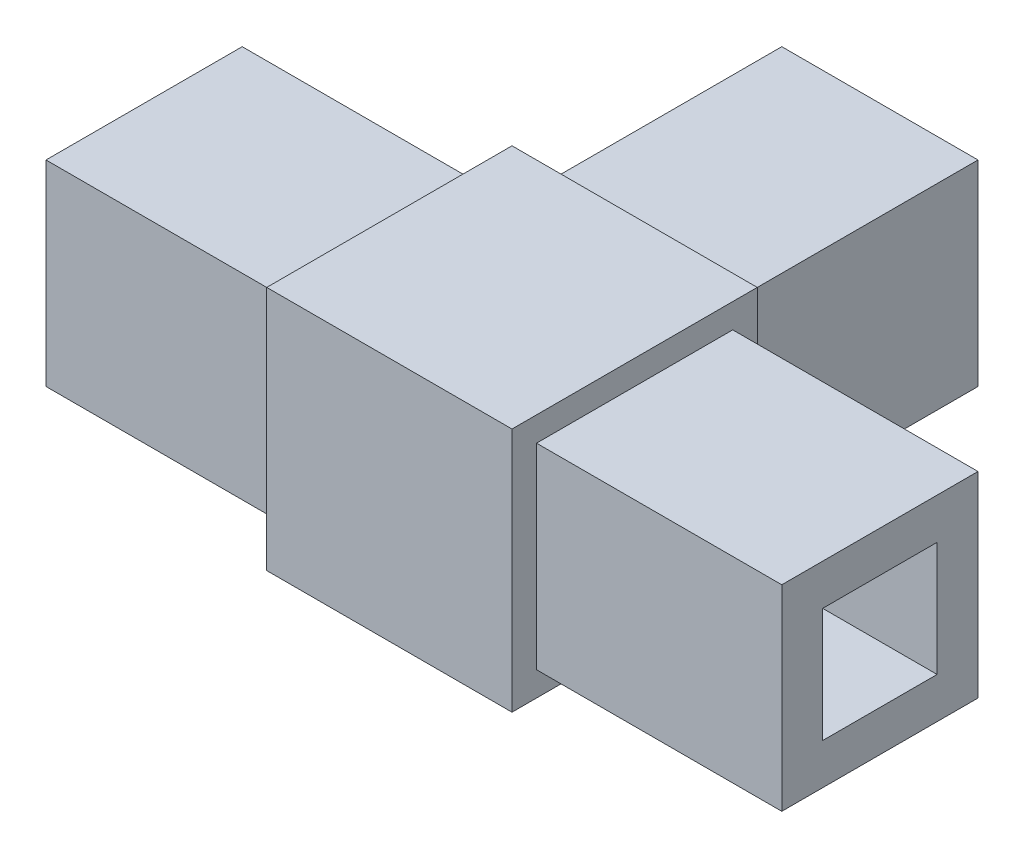
ISO-10303-21;
HEADER;
FILE_DESCRIPTION(('STEP AP214'),'2;1');
FILE_NAME('part.step','',(''),(''),'','','');
FILE_SCHEMA(('AUTOMOTIVE_DESIGN { 1 0 10303 214 1 1 1 1 }'));
ENDSEC;
DATA;
#1=APPLICATION_CONTEXT('core data for automotive mechanical design processes');
#2=APPLICATION_PROTOCOL_DEFINITION('international standard','automotive_design',2000,#1);
#3=PRODUCT_CONTEXT('',#1,'mechanical');
#4=PRODUCT('Part','Part','',(#3));
#5=PRODUCT_RELATED_PRODUCT_CATEGORY('part','',(#4));
#6=PRODUCT_DEFINITION_FORMATION('','',#4);
#7=PRODUCT_DEFINITION_CONTEXT('part definition',#1,'design');
#8=PRODUCT_DEFINITION('design','',#6,#7);
#9=PRODUCT_DEFINITION_SHAPE('','',#8);
#10=(LENGTH_UNIT() NAMED_UNIT(*) SI_UNIT(.MILLI.,.METRE.));
#11=(NAMED_UNIT(*) PLANE_ANGLE_UNIT() SI_UNIT($,.RADIAN.));
#12=(NAMED_UNIT(*) SI_UNIT($,.STERADIAN.) SOLID_ANGLE_UNIT());
#13=UNCERTAINTY_MEASURE_WITH_UNIT(LENGTH_MEASURE(1.E-05),#10,'distance_accuracy_value','');
#14=(GEOMETRIC_REPRESENTATION_CONTEXT(3) GLOBAL_UNCERTAINTY_ASSIGNED_CONTEXT((#13)) GLOBAL_UNIT_ASSIGNED_CONTEXT((#10,
#11,#12)) REPRESENTATION_CONTEXT('',''));
#15=CARTESIAN_POINT('',(0.,0.,0.));
#16=DIRECTION('',(0.,0.,1.));
#17=DIRECTION('',(1.,0.,0.));
#18=AXIS2_PLACEMENT_3D('',#15,#16,#17);
#19=CARTESIAN_POINT('',(45.,30.,-7.72719918892597));
#20=DIRECTION('',(-1.,0.,0.));
#21=DIRECTION('',(0.,0.,1.));
#22=AXIS2_PLACEMENT_3D('',#19,#20,#21);
#23=PLANE('',#22);
#24=DIRECTION('',(0.,-1.,0.));
#25=VECTOR('',#24,1.);
#26=CARTESIAN_POINT('',(45.,27.,12.));
#27=LINE('',#26,#25);
#28=CARTESIAN_POINT('',(45.,27.,12.));
#29=VERTEX_POINT('',#28);
#30=CARTESIAN_POINT('',(45.,3.,12.));
#31=VERTEX_POINT('',#30);
#32=EDGE_CURVE('E459',#29,#31,#27,.T.);
#33=ORIENTED_EDGE('',*,*,#32,.T.);
#34=DIRECTION('',(0.,0.,-1.));
#35=VECTOR('',#34,1.);
#36=CARTESIAN_POINT('',(45.,3.,12.));
#37=LINE('',#36,#35);
#38=CARTESIAN_POINT('',(45.,3.,-12.));
#39=VERTEX_POINT('',#38);
#40=EDGE_CURVE('E476',#31,#39,#37,.T.);
#41=ORIENTED_EDGE('',*,*,#40,.T.);
#42=DIRECTION('',(0.,1.,0.));
#43=VECTOR('',#42,1.);
#44=CARTESIAN_POINT('',(45.,3.,-12.));
#45=LINE('',#44,#43);
#46=CARTESIAN_POINT('',(45.,27.,-12.));
#47=VERTEX_POINT('',#46);
#48=EDGE_CURVE('E479',#39,#47,#45,.T.);
#49=ORIENTED_EDGE('',*,*,#48,.T.);
#50=DIRECTION('',(0.,0.,1.));
#51=VECTOR('',#50,1.);
#52=CARTESIAN_POINT('',(45.,27.,-12.));
#53=LINE('',#52,#51);
#54=EDGE_CURVE('E464',#47,#29,#53,.T.);
#55=ORIENTED_EDGE('',*,*,#54,.T.);
#56=EDGE_LOOP('',(#33,#41,#49,#55));
#57=FACE_BOUND('',#56,.T.);
#58=DIRECTION('',(0.,-1.,0.));
#59=VECTOR('',#58,1.);
#60=CARTESIAN_POINT('',(45.,27.,6.99999999999999));
#61=LINE('',#60,#59);
#62=CARTESIAN_POINT('',(45.,22.,6.99999999999999));
#63=VERTEX_POINT('',#62);
#64=CARTESIAN_POINT('',(45.,8.,6.99999999999999));
#65=VERTEX_POINT('',#64);
#66=EDGE_CURVE('E269',#63,#65,#61,.T.);
#67=ORIENTED_EDGE('',*,*,#66,.F.);
#68=DIRECTION('',(0.,0.,1.));
#69=VECTOR('',#68,1.);
#70=CARTESIAN_POINT('',(45.,22.,-12.));
#71=LINE('',#70,#69);
#72=CARTESIAN_POINT('',(45.,22.,-7.));
#73=VERTEX_POINT('',#72);
#74=EDGE_CURVE('E325',#73,#63,#71,.T.);
#75=ORIENTED_EDGE('',*,*,#74,.F.);
#76=DIRECTION('',(0.,1.,0.));
#77=VECTOR('',#76,1.);
#78=CARTESIAN_POINT('',(45.,3.,-7.));
#79=LINE('',#78,#77);
#80=CARTESIAN_POINT('',(45.,8.,-7.));
#81=VERTEX_POINT('',#80);
#82=EDGE_CURVE('E54',#81,#73,#79,.T.);
#83=ORIENTED_EDGE('',*,*,#82,.F.);
#84=DIRECTION('',(0.,0.,-1.));
#85=VECTOR('',#84,1.);
#86=CARTESIAN_POINT('',(45.,8.,12.));
#87=LINE('',#86,#85);
#88=EDGE_CURVE('E361',#65,#81,#87,.T.);
#89=ORIENTED_EDGE('',*,*,#88,.F.);
#90=EDGE_LOOP('',(#67,#75,#83,#89));
#91=FACE_BOUND('',#90,.T.);
#92=ADVANCED_FACE('F37',(#57,#91),#23,.F.);
#93=CARTESIAN_POINT('',(-93.2360966917663,30.,-7.72719918892597));
#94=DIRECTION('',(0.,1.,0.));
#95=DIRECTION('',(0.,0.,1.));
#96=AXIS2_PLACEMENT_3D('',#93,#94,#95);
#97=PLANE('',#96);
#98=DIRECTION('',(-1.,0.,0.));
#99=VECTOR('',#98,1.);
#100=CARTESIAN_POINT('',(-93.2360966917663,30.,-15.));
#101=LINE('',#100,#99);
#102=CARTESIAN_POINT('',(15.,30.,-15.));
#103=VERTEX_POINT('',#102);
#104=CARTESIAN_POINT('',(-15.,30.,-15.));
#105=VERTEX_POINT('',#104);
#106=EDGE_CURVE('E496',#103,#105,#101,.T.);
#107=ORIENTED_EDGE('',*,*,#106,.T.);
#108=DIRECTION('',(0.,0.,-1.));
#109=VECTOR('',#108,1.);
#110=CARTESIAN_POINT('',(-15.,30.,15.));
#111=LINE('',#110,#109);
#112=CARTESIAN_POINT('',(-15.,30.,15.));
#113=VERTEX_POINT('',#112);
#114=EDGE_CURVE('E421',#113,#105,#111,.T.);
#115=ORIENTED_EDGE('',*,*,#114,.F.);
#116=DIRECTION('',(-1.,0.,0.));
#117=VECTOR('',#116,1.);
#118=CARTESIAN_POINT('',(-93.2360966917663,30.,15.));
#119=LINE('',#118,#117);
#120=CARTESIAN_POINT('',(15.,30.,15.));
#121=VERTEX_POINT('',#120);
#122=EDGE_CURVE('E46',#121,#113,#119,.T.);
#123=ORIENTED_EDGE('',*,*,#122,.F.);
#124=DIRECTION('',(0.,0.,-1.));
#125=VECTOR('',#124,1.);
#126=CARTESIAN_POINT('',(15.,30.,-7.72719918892597));
#127=LINE('',#126,#125);
#128=EDGE_CURVE('E11',#121,#103,#127,.T.);
#129=ORIENTED_EDGE('',*,*,#128,.T.);
#130=EDGE_LOOP('',(#107,#115,#123,#129));
#131=FACE_BOUND('',#130,.T.);
#132=ADVANCED_FACE('F517',(#131),#97,.T.);
#133=CARTESIAN_POINT('',(-93.2360966917663,0.,-7.72719918892597));
#134=DIRECTION('',(0.,1.,0.));
#135=DIRECTION('',(0.,0.,1.));
#136=AXIS2_PLACEMENT_3D('',#133,#134,#135);
#137=PLANE('',#136);
#138=DIRECTION('',(0.,0.,1.));
#139=VECTOR('',#138,1.);
#140=CARTESIAN_POINT('',(-15.,0.,-15.));
#141=LINE('',#140,#139);
#142=CARTESIAN_POINT('',(-15.,0.,-15.));
#143=VERTEX_POINT('',#142);
#144=CARTESIAN_POINT('',(-15.,0.,15.));
#145=VERTEX_POINT('',#144);
#146=EDGE_CURVE('E417',#143,#145,#141,.T.);
#147=ORIENTED_EDGE('',*,*,#146,.F.);
#148=DIRECTION('',(-1.,0.,0.));
#149=VECTOR('',#148,1.);
#150=CARTESIAN_POINT('',(-93.2360966917663,0.,-15.));
#151=LINE('',#150,#149);
#152=CARTESIAN_POINT('',(15.,0.,-15.));
#153=VERTEX_POINT('',#152);
#154=EDGE_CURVE('E495',#153,#143,#151,.T.);
#155=ORIENTED_EDGE('',*,*,#154,.F.);
#156=DIRECTION('',(0.,0.,-1.));
#157=VECTOR('',#156,1.);
#158=CARTESIAN_POINT('',(15.,0.,-7.72719918892597));
#159=LINE('',#158,#157);
#160=CARTESIAN_POINT('',(15.,0.,15.));
#161=VERTEX_POINT('',#160);
#162=EDGE_CURVE('E41',#161,#153,#159,.T.);
#163=ORIENTED_EDGE('',*,*,#162,.F.);
#164=DIRECTION('',(-1.,0.,0.));
#165=VECTOR('',#164,1.);
#166=CARTESIAN_POINT('',(-93.2360966917663,0.,15.));
#167=LINE('',#166,#165);
#168=EDGE_CURVE('E502',#161,#145,#167,.T.);
#169=ORIENTED_EDGE('',*,*,#168,.T.);
#170=EDGE_LOOP('',(#147,#155,#163,#169));
#171=FACE_BOUND('',#170,.T.);
#172=ADVANCED_FACE('F512',(#171),#137,.F.);
#173=CARTESIAN_POINT('',(-93.2360966917663,30.,15.));
#174=DIRECTION('',(0.,0.,1.));
#175=DIRECTION('',(1.,0.,0.));
#176=AXIS2_PLACEMENT_3D('',#173,#174,#175);
#177=PLANE('',#176);
#178=ORIENTED_EDGE('',*,*,#122,.T.);
#179=DIRECTION('',(0.,1.,0.));
#180=VECTOR('',#179,1.);
#181=CARTESIAN_POINT('',(-15.,0.,15.));
#182=LINE('',#181,#180);
#183=EDGE_CURVE('E419',#145,#113,#182,.T.);
#184=ORIENTED_EDGE('',*,*,#183,.F.);
#185=ORIENTED_EDGE('',*,*,#168,.F.);
#186=DIRECTION('',(0.,-1.,0.));
#187=VECTOR('',#186,1.);
#188=CARTESIAN_POINT('',(15.,30.,15.));
#189=LINE('',#188,#187);
#190=EDGE_CURVE('E486',#121,#161,#189,.T.);
#191=ORIENTED_EDGE('',*,*,#190,.F.);
#192=EDGE_LOOP('',(#178,#184,#185,#191));
#193=FACE_BOUND('',#192,.T.);
#194=ADVANCED_FACE('F520',(#193),#177,.T.);
#195=CARTESIAN_POINT('',(-93.2360966917663,30.,-15.));
#196=DIRECTION('',(0.,0.,1.));
#197=DIRECTION('',(1.,0.,0.));
#198=AXIS2_PLACEMENT_3D('',#195,#196,#197);
#199=PLANE('',#198);
#200=DIRECTION('',(1.,0.,0.));
#201=VECTOR('',#200,1.);
#202=CARTESIAN_POINT('',(-12.,27.,-15.));
#203=LINE('',#202,#201);
#204=CARTESIAN_POINT('',(-12.,27.,-15.));
#205=VERTEX_POINT('',#204);
#206=CARTESIAN_POINT('',(12.,27.,-15.));
#207=VERTEX_POINT('',#206);
#208=EDGE_CURVE('E434',#205,#207,#203,.T.);
#209=ORIENTED_EDGE('',*,*,#208,.F.);
#210=DIRECTION('',(0.,1.,0.));
#211=VECTOR('',#210,1.);
#212=CARTESIAN_POINT('',(-12.,3.,-15.));
#213=LINE('',#212,#211);
#214=CARTESIAN_POINT('',(-12.,3.,-15.));
#215=VERTEX_POINT('',#214);
#216=EDGE_CURVE('E431',#215,#205,#213,.T.);
#217=ORIENTED_EDGE('',*,*,#216,.F.);
#218=DIRECTION('',(-1.,0.,0.));
#219=VECTOR('',#218,1.);
#220=CARTESIAN_POINT('',(12.,3.,-15.));
#221=LINE('',#220,#219);
#222=CARTESIAN_POINT('',(12.,3.,-15.));
#223=VERTEX_POINT('',#222);
#224=EDGE_CURVE('E427',#223,#215,#221,.T.);
#225=ORIENTED_EDGE('',*,*,#224,.F.);
#226=DIRECTION('',(0.,-1.,0.));
#227=VECTOR('',#226,1.);
#228=CARTESIAN_POINT('',(12.,27.,-15.));
#229=LINE('',#228,#227);
#230=EDGE_CURVE('E424',#207,#223,#229,.T.);
#231=ORIENTED_EDGE('',*,*,#230,.F.);
#232=EDGE_LOOP('',(#209,#217,#225,#231));
#233=FACE_BOUND('',#232,.T.);
#234=DIRECTION('',(0.,-1.,0.));
#235=VECTOR('',#234,1.);
#236=CARTESIAN_POINT('',(-15.,30.,-15.));
#237=LINE('',#236,#235);
#238=EDGE_CURVE('E409',#105,#143,#237,.T.);
#239=ORIENTED_EDGE('',*,*,#238,.F.);
#240=ORIENTED_EDGE('',*,*,#106,.F.);
#241=DIRECTION('',(0.,-1.,0.));
#242=VECTOR('',#241,1.);
#243=CARTESIAN_POINT('',(15.,30.,-15.));
#244=LINE('',#243,#242);
#245=EDGE_CURVE('E450',#103,#153,#244,.T.);
#246=ORIENTED_EDGE('',*,*,#245,.T.);
#247=ORIENTED_EDGE('',*,*,#154,.T.);
#248=EDGE_LOOP('',(#239,#240,#246,#247));
#249=FACE_BOUND('',#248,.T.);
#250=ADVANCED_FACE('F39',(#233,#249),#199,.F.);
#251=CARTESIAN_POINT('',(15.,30.,-7.72719918892597));
#252=DIRECTION('',(-1.,0.,0.));
#253=DIRECTION('',(0.,0.,1.));
#254=AXIS2_PLACEMENT_3D('',#251,#252,#253);
#255=PLANE('',#254);
#256=DIRECTION('',(0.,0.,1.));
#257=VECTOR('',#256,1.);
#258=CARTESIAN_POINT('',(15.,27.,-12.));
#259=LINE('',#258,#257);
#260=CARTESIAN_POINT('',(15.,27.,-12.));
#261=VERTEX_POINT('',#260);
#262=CARTESIAN_POINT('',(15.,27.,12.));
#263=VERTEX_POINT('',#262);
#264=EDGE_CURVE('E470',#261,#263,#259,.T.);
#265=ORIENTED_EDGE('',*,*,#264,.F.);
#266=DIRECTION('',(0.,1.,0.));
#267=VECTOR('',#266,1.);
#268=CARTESIAN_POINT('',(15.,3.,-12.));
#269=LINE('',#268,#267);
#270=CARTESIAN_POINT('',(15.,3.,-12.));
#271=VERTEX_POINT('',#270);
#272=EDGE_CURVE('E467',#271,#261,#269,.T.);
#273=ORIENTED_EDGE('',*,*,#272,.F.);
#274=DIRECTION('',(0.,0.,-1.));
#275=VECTOR('',#274,1.);
#276=CARTESIAN_POINT('',(15.,3.,12.));
#277=LINE('',#276,#275);
#278=CARTESIAN_POINT('',(15.,3.,12.));
#279=VERTEX_POINT('',#278);
#280=EDGE_CURVE('E463',#279,#271,#277,.T.);
#281=ORIENTED_EDGE('',*,*,#280,.F.);
#282=DIRECTION('',(0.,-1.,0.));
#283=VECTOR('',#282,1.);
#284=CARTESIAN_POINT('',(15.,27.,12.));
#285=LINE('',#284,#283);
#286=EDGE_CURVE('E460',#263,#279,#285,.T.);
#287=ORIENTED_EDGE('',*,*,#286,.F.);
#288=EDGE_LOOP('',(#265,#273,#281,#287));
#289=FACE_BOUND('',#288,.T.);
#290=ORIENTED_EDGE('',*,*,#245,.F.);
#291=ORIENTED_EDGE('',*,*,#128,.F.);
#292=ORIENTED_EDGE('',*,*,#190,.T.);
#293=ORIENTED_EDGE('',*,*,#162,.T.);
#294=EDGE_LOOP('',(#290,#291,#292,#293));
#295=FACE_BOUND('',#294,.T.);
#296=ADVANCED_FACE('F510',(#289,#295),#255,.F.);
#297=CARTESIAN_POINT('',(15.,27.,12.));
#298=DIRECTION('',(0.,0.,1.));
#299=DIRECTION('',(1.,0.,0.));
#300=AXIS2_PLACEMENT_3D('',#297,#298,#299);
#301=PLANE('',#300);
#302=ORIENTED_EDGE('',*,*,#32,.F.);
#303=DIRECTION('',(1.,0.,0.));
#304=VECTOR('',#303,1.);
#305=CARTESIAN_POINT('',(15.,27.,12.));
#306=LINE('',#305,#304);
#307=EDGE_CURVE('E484',#263,#29,#306,.T.);
#308=ORIENTED_EDGE('',*,*,#307,.F.);
#309=ORIENTED_EDGE('',*,*,#286,.T.);
#310=DIRECTION('',(1.,0.,0.));
#311=VECTOR('',#310,1.);
#312=CARTESIAN_POINT('',(15.,3.,12.));
#313=LINE('',#312,#311);
#314=EDGE_CURVE('E473',#279,#31,#313,.T.);
#315=ORIENTED_EDGE('',*,*,#314,.T.);
#316=EDGE_LOOP('',(#302,#308,#309,#315));
#317=FACE_BOUND('',#316,.T.);
#318=ADVANCED_FACE('F906',(#317),#301,.T.);
#319=CARTESIAN_POINT('',(15.,27.,-12.));
#320=DIRECTION('',(0.,1.,0.));
#321=DIRECTION('',(0.,0.,1.));
#322=AXIS2_PLACEMENT_3D('',#319,#320,#321);
#323=PLANE('',#322);
#324=ORIENTED_EDGE('',*,*,#54,.F.);
#325=DIRECTION('',(1.,0.,0.));
#326=VECTOR('',#325,1.);
#327=CARTESIAN_POINT('',(15.,27.,-12.));
#328=LINE('',#327,#326);
#329=EDGE_CURVE('E487',#261,#47,#328,.T.);
#330=ORIENTED_EDGE('',*,*,#329,.F.);
#331=ORIENTED_EDGE('',*,*,#264,.T.);
#332=ORIENTED_EDGE('',*,*,#307,.T.);
#333=EDGE_LOOP('',(#324,#330,#331,#332));
#334=FACE_BOUND('',#333,.T.);
#335=ADVANCED_FACE('F924',(#334),#323,.T.);
#336=CARTESIAN_POINT('',(15.,3.,-12.));
#337=DIRECTION('',(0.,0.,-1.));
#338=DIRECTION('',(-1.,0.,0.));
#339=AXIS2_PLACEMENT_3D('',#336,#337,#338);
#340=PLANE('',#339);
#341=ORIENTED_EDGE('',*,*,#48,.F.);
#342=DIRECTION('',(1.,0.,0.));
#343=VECTOR('',#342,1.);
#344=CARTESIAN_POINT('',(15.,3.,-12.));
#345=LINE('',#344,#343);
#346=EDGE_CURVE('E489',#271,#39,#345,.T.);
#347=ORIENTED_EDGE('',*,*,#346,.F.);
#348=ORIENTED_EDGE('',*,*,#272,.T.);
#349=ORIENTED_EDGE('',*,*,#329,.T.);
#350=EDGE_LOOP('',(#341,#347,#348,#349));
#351=FACE_BOUND('',#350,.T.);
#352=ADVANCED_FACE('F914',(#351),#340,.T.);
#353=CARTESIAN_POINT('',(15.,3.,12.));
#354=DIRECTION('',(0.,-1.,0.));
#355=DIRECTION('',(0.,0.,-1.));
#356=AXIS2_PLACEMENT_3D('',#353,#354,#355);
#357=PLANE('',#356);
#358=ORIENTED_EDGE('',*,*,#40,.F.);
#359=ORIENTED_EDGE('',*,*,#314,.F.);
#360=ORIENTED_EDGE('',*,*,#280,.T.);
#361=ORIENTED_EDGE('',*,*,#346,.T.);
#362=EDGE_LOOP('',(#358,#359,#360,#361));
#363=FACE_BOUND('',#362,.T.);
#364=ADVANCED_FACE('F896',(#363),#357,.T.);
#365=CARTESIAN_POINT('',(12.,27.,-15.));
#366=DIRECTION('',(1.,0.,0.));
#367=DIRECTION('',(0.,1.,0.));
#368=AXIS2_PLACEMENT_3D('',#365,#366,#367);
#369=PLANE('',#368);
#370=DIRECTION('',(0.,-1.,0.));
#371=VECTOR('',#370,1.);
#372=CARTESIAN_POINT('',(12.,27.,-45.));
#373=LINE('',#372,#371);
#374=CARTESIAN_POINT('',(12.,27.,-45.));
#375=VERTEX_POINT('',#374);
#376=CARTESIAN_POINT('',(12.,3.,-45.));
#377=VERTEX_POINT('',#376);
#378=EDGE_CURVE('E423',#375,#377,#373,.T.);
#379=ORIENTED_EDGE('',*,*,#378,.F.);
#380=DIRECTION('',(0.,0.,-1.));
#381=VECTOR('',#380,1.);
#382=CARTESIAN_POINT('',(12.,27.,-15.));
#383=LINE('',#382,#381);
#384=EDGE_CURVE('E448',#207,#375,#383,.T.);
#385=ORIENTED_EDGE('',*,*,#384,.F.);
#386=ORIENTED_EDGE('',*,*,#230,.T.);
#387=DIRECTION('',(0.,0.,-1.));
#388=VECTOR('',#387,1.);
#389=CARTESIAN_POINT('',(12.,3.,-15.));
#390=LINE('',#389,#388);
#391=EDGE_CURVE('E437',#223,#377,#390,.T.);
#392=ORIENTED_EDGE('',*,*,#391,.T.);
#393=EDGE_LOOP('',(#379,#385,#386,#392));
#394=FACE_BOUND('',#393,.T.);
#395=ADVANCED_FACE('F887',(#394),#369,.T.);
#396=CARTESIAN_POINT('',(-12.,27.,-15.));
#397=DIRECTION('',(0.,1.,0.));
#398=DIRECTION('',(-1.,0.,0.));
#399=AXIS2_PLACEMENT_3D('',#396,#397,#398);
#400=PLANE('',#399);
#401=DIRECTION('',(1.,0.,0.));
#402=VECTOR('',#401,1.);
#403=CARTESIAN_POINT('',(-12.,27.,-45.));
#404=LINE('',#403,#402);
#405=CARTESIAN_POINT('',(-12.,27.,-45.));
#406=VERTEX_POINT('',#405);
#407=EDGE_CURVE('E428',#406,#375,#404,.T.);
#408=ORIENTED_EDGE('',*,*,#407,.F.);
#409=DIRECTION('',(0.,0.,-1.));
#410=VECTOR('',#409,1.);
#411=CARTESIAN_POINT('',(-12.,27.,-15.));
#412=LINE('',#411,#410);
#413=EDGE_CURVE('E451',#205,#406,#412,.T.);
#414=ORIENTED_EDGE('',*,*,#413,.F.);
#415=ORIENTED_EDGE('',*,*,#208,.T.);
#416=ORIENTED_EDGE('',*,*,#384,.T.);
#417=EDGE_LOOP('',(#408,#414,#415,#416));
#418=FACE_BOUND('',#417,.T.);
#419=ADVANCED_FACE('F877',(#418),#400,.T.);
#420=CARTESIAN_POINT('',(-12.,3.,-15.));
#421=DIRECTION('',(-1.,0.,0.));
#422=DIRECTION('',(0.,0.,1.));
#423=AXIS2_PLACEMENT_3D('',#420,#421,#422);
#424=PLANE('',#423);
#425=DIRECTION('',(0.,1.,0.));
#426=VECTOR('',#425,1.);
#427=CARTESIAN_POINT('',(-12.,3.,-45.));
#428=LINE('',#427,#426);
#429=CARTESIAN_POINT('',(-12.,3.,-45.));
#430=VERTEX_POINT('',#429);
#431=EDGE_CURVE('E443',#430,#406,#428,.T.);
#432=ORIENTED_EDGE('',*,*,#431,.F.);
#433=DIRECTION('',(0.,0.,-1.));
#434=VECTOR('',#433,1.);
#435=CARTESIAN_POINT('',(-12.,3.,-15.));
#436=LINE('',#435,#434);
#437=EDGE_CURVE('E453',#215,#430,#436,.T.);
#438=ORIENTED_EDGE('',*,*,#437,.F.);
#439=ORIENTED_EDGE('',*,*,#216,.T.);
#440=ORIENTED_EDGE('',*,*,#413,.T.);
#441=EDGE_LOOP('',(#432,#438,#439,#440));
#442=FACE_BOUND('',#441,.T.);
#443=ADVANCED_FACE('F867',(#442),#424,.T.);
#444=CARTESIAN_POINT('',(12.,3.,-15.));
#445=DIRECTION('',(0.,-1.,0.));
#446=DIRECTION('',(1.,0.,0.));
#447=AXIS2_PLACEMENT_3D('',#444,#445,#446);
#448=PLANE('',#447);
#449=DIRECTION('',(-1.,0.,0.));
#450=VECTOR('',#449,1.);
#451=CARTESIAN_POINT('',(12.,3.,-45.));
#452=LINE('',#451,#450);
#453=EDGE_CURVE('E440',#377,#430,#452,.T.);
#454=ORIENTED_EDGE('',*,*,#453,.F.);
#455=ORIENTED_EDGE('',*,*,#391,.F.);
#456=ORIENTED_EDGE('',*,*,#224,.T.);
#457=ORIENTED_EDGE('',*,*,#437,.T.);
#458=EDGE_LOOP('',(#454,#455,#456,#457));
#459=FACE_BOUND('',#458,.T.);
#460=ADVANCED_FACE('F536',(#459),#448,.T.);
#461=CARTESIAN_POINT('',(-93.2360966917663,30.,-45.));
#462=DIRECTION('',(0.,0.,-1.));
#463=DIRECTION('',(-1.,0.,0.));
#464=AXIS2_PLACEMENT_3D('',#461,#462,#463);
#465=PLANE('',#464);
#466=DIRECTION('',(1.,0.,0.));
#467=VECTOR('',#466,1.);
#468=CARTESIAN_POINT('',(-93.2360966917663,22.,-45.));
#469=LINE('',#468,#467);
#470=CARTESIAN_POINT('',(-7.,22.,-45.));
#471=VERTEX_POINT('',#470);
#472=CARTESIAN_POINT('',(7.,22.,-45.));
#473=VERTEX_POINT('',#472);
#474=EDGE_CURVE('E309',#471,#473,#469,.T.);
#475=ORIENTED_EDGE('',*,*,#474,.F.);
#476=DIRECTION('',(0.,1.,0.));
#477=VECTOR('',#476,1.);
#478=CARTESIAN_POINT('',(-7.00000000000001,30.,-45.));
#479=LINE('',#478,#477);
#480=CARTESIAN_POINT('',(-7.,8.,-45.));
#481=VERTEX_POINT('',#480);
#482=EDGE_CURVE('E371',#481,#471,#479,.T.);
#483=ORIENTED_EDGE('',*,*,#482,.F.);
#484=DIRECTION('',(-1.,0.,0.));
#485=VECTOR('',#484,1.);
#486=CARTESIAN_POINT('',(-93.2360966917663,8.00000000000001,-45.));
#487=LINE('',#486,#485);
#488=CARTESIAN_POINT('',(7.,8.,-45.));
#489=VERTEX_POINT('',#488);
#490=EDGE_CURVE('E62',#489,#481,#487,.T.);
#491=ORIENTED_EDGE('',*,*,#490,.F.);
#492=DIRECTION('',(0.,-1.,0.));
#493=VECTOR('',#492,1.);
#494=CARTESIAN_POINT('',(7.00000000000001,30.,-45.));
#495=LINE('',#494,#493);
#496=EDGE_CURVE('E367',#473,#489,#495,.T.);
#497=ORIENTED_EDGE('',*,*,#496,.F.);
#498=EDGE_LOOP('',(#475,#483,#491,#497));
#499=FACE_BOUND('',#498,.T.);
#500=ORIENTED_EDGE('',*,*,#407,.T.);
#501=ORIENTED_EDGE('',*,*,#378,.T.);
#502=ORIENTED_EDGE('',*,*,#453,.T.);
#503=ORIENTED_EDGE('',*,*,#431,.T.);
#504=EDGE_LOOP('',(#500,#501,#502,#503));
#505=FACE_BOUND('',#504,.T.);
#506=ADVANCED_FACE('F526',(#499,#505),#465,.T.);
#507=CARTESIAN_POINT('',(-15.,0.,-15.));
#508=DIRECTION('',(-1.,0.,0.));
#509=DIRECTION('',(0.,0.,1.));
#510=AXIS2_PLACEMENT_3D('',#507,#508,#509);
#511=PLANE('',#510);
#512=DIRECTION('',(0.,0.,-1.));
#513=VECTOR('',#512,1.);
#514=CARTESIAN_POINT('',(-15.,27.,12.));
#515=LINE('',#514,#513);
#516=CARTESIAN_POINT('',(-15.,27.,12.));
#517=VERTEX_POINT('',#516);
#518=CARTESIAN_POINT('',(-15.,27.,-12.));
#519=VERTEX_POINT('',#518);
#520=EDGE_CURVE('E396',#517,#519,#515,.T.);
#521=ORIENTED_EDGE('',*,*,#520,.F.);
#522=DIRECTION('',(0.,1.,0.));
#523=VECTOR('',#522,1.);
#524=CARTESIAN_POINT('',(-15.,3.,12.));
#525=LINE('',#524,#523);
#526=CARTESIAN_POINT('',(-15.,3.,12.));
#527=VERTEX_POINT('',#526);
#528=EDGE_CURVE('E393',#527,#517,#525,.T.);
#529=ORIENTED_EDGE('',*,*,#528,.F.);
#530=DIRECTION('',(0.,0.,1.));
#531=VECTOR('',#530,1.);
#532=CARTESIAN_POINT('',(-15.,3.,-12.));
#533=LINE('',#532,#531);
#534=CARTESIAN_POINT('',(-15.,3.,-12.));
#535=VERTEX_POINT('',#534);
#536=EDGE_CURVE('E389',#535,#527,#533,.T.);
#537=ORIENTED_EDGE('',*,*,#536,.F.);
#538=DIRECTION('',(0.,-1.,0.));
#539=VECTOR('',#538,1.);
#540=CARTESIAN_POINT('',(-15.,27.,-12.));
#541=LINE('',#540,#539);
#542=EDGE_CURVE('E386',#519,#535,#541,.T.);
#543=ORIENTED_EDGE('',*,*,#542,.F.);
#544=EDGE_LOOP('',(#521,#529,#537,#543));
#545=FACE_BOUND('',#544,.T.);
#546=ORIENTED_EDGE('',*,*,#238,.T.);
#547=ORIENTED_EDGE('',*,*,#146,.T.);
#548=ORIENTED_EDGE('',*,*,#183,.T.);
#549=ORIENTED_EDGE('',*,*,#114,.T.);
#550=EDGE_LOOP('',(#546,#547,#548,#549));
#551=FACE_BOUND('',#550,.T.);
#552=ADVANCED_FACE('F523',(#545,#551),#511,.T.);
#553=CARTESIAN_POINT('',(-15.,27.,-12.));
#554=DIRECTION('',(0.,0.,-1.));
#555=DIRECTION('',(0.,1.,0.));
#556=AXIS2_PLACEMENT_3D('',#553,#554,#555);
#557=PLANE('',#556);
#558=DIRECTION('',(0.,-1.,0.));
#559=VECTOR('',#558,1.);
#560=CARTESIAN_POINT('',(-45.,27.,-12.));
#561=LINE('',#560,#559);
#562=CARTESIAN_POINT('',(-45.,27.,-12.));
#563=VERTEX_POINT('',#562);
#564=CARTESIAN_POINT('',(-45.,3.,-12.));
#565=VERTEX_POINT('',#564);
#566=EDGE_CURVE('E276',#563,#565,#561,.T.);
#567=ORIENTED_EDGE('',*,*,#566,.F.);
#568=DIRECTION('',(-1.,0.,0.));
#569=VECTOR('',#568,1.);
#570=CARTESIAN_POINT('',(-15.,27.,-12.));
#571=LINE('',#570,#569);
#572=EDGE_CURVE('E407',#519,#563,#571,.T.);
#573=ORIENTED_EDGE('',*,*,#572,.F.);
#574=ORIENTED_EDGE('',*,*,#542,.T.);
#575=DIRECTION('',(-1.,0.,0.));
#576=VECTOR('',#575,1.);
#577=CARTESIAN_POINT('',(-15.,3.,-12.));
#578=LINE('',#577,#576);
#579=EDGE_CURVE('E398',#535,#565,#578,.T.);
#580=ORIENTED_EDGE('',*,*,#579,.T.);
#581=EDGE_LOOP('',(#567,#573,#574,#580));
#582=FACE_BOUND('',#581,.T.);
#583=ADVANCED_FACE('F525',(#582),#557,.T.);
#584=CARTESIAN_POINT('',(-15.,27.,12.));
#585=DIRECTION('',(0.,1.,0.));
#586=DIRECTION('',(0.,0.,1.));
#587=AXIS2_PLACEMENT_3D('',#584,#585,#586);
#588=PLANE('',#587);
#589=DIRECTION('',(0.,0.,-1.));
#590=VECTOR('',#589,1.);
#591=CARTESIAN_POINT('',(-45.,27.,12.));
#592=LINE('',#591,#590);
#593=CARTESIAN_POINT('',(-45.,27.,12.));
#594=VERTEX_POINT('',#593);
#595=EDGE_CURVE('E390',#594,#563,#592,.T.);
#596=ORIENTED_EDGE('',*,*,#595,.F.);
#597=DIRECTION('',(-1.,0.,0.));
#598=VECTOR('',#597,1.);
#599=CARTESIAN_POINT('',(-15.,27.,12.));
#600=LINE('',#599,#598);
#601=EDGE_CURVE('E410',#517,#594,#600,.T.);
#602=ORIENTED_EDGE('',*,*,#601,.F.);
#603=ORIENTED_EDGE('',*,*,#520,.T.);
#604=ORIENTED_EDGE('',*,*,#572,.T.);
#605=EDGE_LOOP('',(#596,#602,#603,#604));
#606=FACE_BOUND('',#605,.T.);
#607=ADVANCED_FACE('F533',(#606),#588,.T.);
#608=CARTESIAN_POINT('',(-15.,3.,12.));
#609=DIRECTION('',(0.,0.,1.));
#610=DIRECTION('',(1.,0.,0.));
#611=AXIS2_PLACEMENT_3D('',#608,#609,#610);
#612=PLANE('',#611);
#613=DIRECTION('',(0.,1.,0.));
#614=VECTOR('',#613,1.);
#615=CARTESIAN_POINT('',(-45.,3.,12.));
#616=LINE('',#615,#614);
#617=CARTESIAN_POINT('',(-45.,3.,12.));
#618=VERTEX_POINT('',#617);
#619=EDGE_CURVE('E402',#618,#594,#616,.T.);
#620=ORIENTED_EDGE('',*,*,#619,.F.);
#621=DIRECTION('',(-1.,0.,0.));
#622=VECTOR('',#621,1.);
#623=CARTESIAN_POINT('',(-15.,3.,12.));
#624=LINE('',#623,#622);
#625=EDGE_CURVE('E412',#527,#618,#624,.T.);
#626=ORIENTED_EDGE('',*,*,#625,.F.);
#627=ORIENTED_EDGE('',*,*,#528,.T.);
#628=ORIENTED_EDGE('',*,*,#601,.T.);
#629=EDGE_LOOP('',(#620,#626,#627,#628));
#630=FACE_BOUND('',#629,.T.);
#631=ADVANCED_FACE('F562',(#630),#612,.T.);
#632=CARTESIAN_POINT('',(-15.,3.,-12.));
#633=DIRECTION('',(0.,-1.,0.));
#634=DIRECTION('',(0.,0.,-1.));
#635=AXIS2_PLACEMENT_3D('',#632,#633,#634);
#636=PLANE('',#635);
#637=DIRECTION('',(0.,0.,1.));
#638=VECTOR('',#637,1.);
#639=CARTESIAN_POINT('',(-45.,3.,-12.));
#640=LINE('',#639,#638);
#641=EDGE_CURVE('E279',#565,#618,#640,.T.);
#642=ORIENTED_EDGE('',*,*,#641,.F.);
#643=ORIENTED_EDGE('',*,*,#579,.F.);
#644=ORIENTED_EDGE('',*,*,#536,.T.);
#645=ORIENTED_EDGE('',*,*,#625,.T.);
#646=EDGE_LOOP('',(#642,#643,#644,#645));
#647=FACE_BOUND('',#646,.T.);
#648=ADVANCED_FACE('F554',(#647),#636,.T.);
#649=CARTESIAN_POINT('',(-45.,30.,-7.72719918892596));
#650=DIRECTION('',(-1.,0.,0.));
#651=DIRECTION('',(0.,0.,1.));
#652=AXIS2_PLACEMENT_3D('',#649,#650,#651);
#653=PLANE('',#652);
#654=DIRECTION('',(0.,0.,-1.));
#655=VECTOR('',#654,1.);
#656=CARTESIAN_POINT('',(-45.,22.,-7.72719918892596));
#657=LINE('',#656,#655);
#658=CARTESIAN_POINT('',(-45.,22.,7.));
#659=VERTEX_POINT('',#658);
#660=CARTESIAN_POINT('',(-45.,22.,-7.));
#661=VERTEX_POINT('',#660);
#662=EDGE_CURVE('E351',#659,#661,#657,.T.);
#663=ORIENTED_EDGE('',*,*,#662,.F.);
#664=DIRECTION('',(0.,1.,0.));
#665=VECTOR('',#664,1.);
#666=CARTESIAN_POINT('',(-45.,30.,7.));
#667=LINE('',#666,#665);
#668=CARTESIAN_POINT('',(-45.,8.,7.));
#669=VERTEX_POINT('',#668);
#670=EDGE_CURVE('E381',#669,#659,#667,.T.);
#671=ORIENTED_EDGE('',*,*,#670,.F.);
#672=DIRECTION('',(0.,0.,1.));
#673=VECTOR('',#672,1.);
#674=CARTESIAN_POINT('',(-45.,8.,-7.72719918892596));
#675=LINE('',#674,#673);
#676=CARTESIAN_POINT('',(-45.,8.,-6.99999999999999));
#677=VERTEX_POINT('',#676);
#678=EDGE_CURVE('E379',#677,#669,#675,.T.);
#679=ORIENTED_EDGE('',*,*,#678,.F.);
#680=DIRECTION('',(0.,-1.,0.));
#681=VECTOR('',#680,1.);
#682=CARTESIAN_POINT('',(-45.,30.,-7.));
#683=LINE('',#682,#681);
#684=EDGE_CURVE('E376',#661,#677,#683,.T.);
#685=ORIENTED_EDGE('',*,*,#684,.F.);
#686=EDGE_LOOP('',(#663,#671,#679,#685));
#687=FACE_BOUND('',#686,.T.);
#688=ORIENTED_EDGE('',*,*,#595,.T.);
#689=ORIENTED_EDGE('',*,*,#566,.T.);
#690=ORIENTED_EDGE('',*,*,#641,.T.);
#691=ORIENTED_EDGE('',*,*,#619,.T.);
#692=EDGE_LOOP('',(#688,#689,#690,#691));
#693=FACE_BOUND('',#692,.T.);
#694=ADVANCED_FACE('F552',(#687,#693),#653,.T.);
#695=CARTESIAN_POINT('',(-93.2360966917663,25.,-7.72719918892597));
#696=DIRECTION('',(0.,1.,0.));
#697=DIRECTION('',(0.,0.,1.));
#698=AXIS2_PLACEMENT_3D('',#695,#696,#697);
#699=PLANE('',#698);
#700=DIRECTION('',(-1.,0.,0.));
#701=VECTOR('',#700,1.);
#702=CARTESIAN_POINT('',(-93.2360966917663,25.,-9.99999999999998));
#703=LINE('',#702,#701);
#704=CARTESIAN_POINT('',(10.,25.,-10.));
#705=VERTEX_POINT('',#704);
#706=CARTESIAN_POINT('',(-9.99999999999999,25.,-10.));
#707=VERTEX_POINT('',#706);
#708=EDGE_CURVE('E248',#705,#707,#703,.T.);
#709=ORIENTED_EDGE('',*,*,#708,.F.);
#710=DIRECTION('',(0.,0.,-1.));
#711=VECTOR('',#710,1.);
#712=CARTESIAN_POINT('',(10.,25.,-7.72719918892597));
#713=LINE('',#712,#711);
#714=CARTESIAN_POINT('',(10.,25.,9.99999999999999));
#715=VERTEX_POINT('',#714);
#716=EDGE_CURVE('E253',#715,#705,#713,.T.);
#717=ORIENTED_EDGE('',*,*,#716,.F.);
#718=DIRECTION('',(-1.,0.,0.));
#719=VECTOR('',#718,1.);
#720=CARTESIAN_POINT('',(-93.2360966917663,25.,10.));
#721=LINE('',#720,#719);
#722=CARTESIAN_POINT('',(-9.99999999999999,25.,10.));
#723=VERTEX_POINT('',#722);
#724=EDGE_CURVE('E259',#715,#723,#721,.T.);
#725=ORIENTED_EDGE('',*,*,#724,.T.);
#726=DIRECTION('',(0.,0.,-1.));
#727=VECTOR('',#726,1.);
#728=CARTESIAN_POINT('',(-9.99999999999999,25.,-15.));
#729=LINE('',#728,#727);
#730=EDGE_CURVE('E256',#723,#707,#729,.T.);
#731=ORIENTED_EDGE('',*,*,#730,.T.);
#732=EDGE_LOOP('',(#709,#717,#725,#731));
#733=FACE_BOUND('',#732,.T.);
#734=ADVANCED_FACE('F250',(#733),#699,.F.);
#735=CARTESIAN_POINT('',(-93.2360966917663,5.,-7.72719918892597));
#736=DIRECTION('',(0.,1.,0.));
#737=DIRECTION('',(0.,0.,1.));
#738=AXIS2_PLACEMENT_3D('',#735,#736,#737);
#739=PLANE('',#738);
#740=DIRECTION('',(0.,0.,1.));
#741=VECTOR('',#740,1.);
#742=CARTESIAN_POINT('',(-9.99999999999999,5.,-7.72719918892597));
#743=LINE('',#742,#741);
#744=CARTESIAN_POINT('',(-9.99999999999999,5.,-10.));
#745=VERTEX_POINT('',#744);
#746=CARTESIAN_POINT('',(-9.99999999999999,5.,10.));
#747=VERTEX_POINT('',#746);
#748=EDGE_CURVE('E286',#745,#747,#743,.T.);
#749=ORIENTED_EDGE('',*,*,#748,.T.);
#750=DIRECTION('',(-1.,0.,0.));
#751=VECTOR('',#750,1.);
#752=CARTESIAN_POINT('',(-93.2360966917663,5.,10.));
#753=LINE('',#752,#751);
#754=CARTESIAN_POINT('',(10.,5.,9.99999999999999));
#755=VERTEX_POINT('',#754);
#756=EDGE_CURVE('E287',#755,#747,#753,.T.);
#757=ORIENTED_EDGE('',*,*,#756,.F.);
#758=DIRECTION('',(0.,0.,-1.));
#759=VECTOR('',#758,1.);
#760=CARTESIAN_POINT('',(10.,5.,-7.72719918892597));
#761=LINE('',#760,#759);
#762=CARTESIAN_POINT('',(10.,5.,-10.));
#763=VERTEX_POINT('',#762);
#764=EDGE_CURVE('E260',#755,#763,#761,.T.);
#765=ORIENTED_EDGE('',*,*,#764,.T.);
#766=DIRECTION('',(-1.,0.,0.));
#767=VECTOR('',#766,1.);
#768=CARTESIAN_POINT('',(-93.2360966917663,5.,-9.99999999999998));
#769=LINE('',#768,#767);
#770=EDGE_CURVE('E266',#763,#745,#769,.T.);
#771=ORIENTED_EDGE('',*,*,#770,.T.);
#772=EDGE_LOOP('',(#749,#757,#765,#771));
#773=FACE_BOUND('',#772,.T.);
#774=ADVANCED_FACE('F560',(#773),#739,.T.);
#775=CARTESIAN_POINT('',(-93.2360966917663,30.,10.));
#776=DIRECTION('',(0.,0.,1.));
#777=DIRECTION('',(1.,0.,0.));
#778=AXIS2_PLACEMENT_3D('',#775,#776,#777);
#779=PLANE('',#778);
#780=ORIENTED_EDGE('',*,*,#724,.F.);
#781=DIRECTION('',(0.,-1.,0.));
#782=VECTOR('',#781,1.);
#783=CARTESIAN_POINT('',(9.99999999999999,30.,9.99999999999999));
#784=LINE('',#783,#782);
#785=EDGE_CURVE('E274',#715,#755,#784,.T.);
#786=ORIENTED_EDGE('',*,*,#785,.T.);
#787=ORIENTED_EDGE('',*,*,#756,.T.);
#788=DIRECTION('',(0.,1.,0.));
#789=VECTOR('',#788,1.);
#790=CARTESIAN_POINT('',(-9.99999999999999,0.,9.99999999999999));
#791=LINE('',#790,#789);
#792=EDGE_CURVE('E284',#747,#723,#791,.T.);
#793=ORIENTED_EDGE('',*,*,#792,.T.);
#794=EDGE_LOOP('',(#780,#786,#787,#793));
#795=FACE_BOUND('',#794,.T.);
#796=ADVANCED_FACE('F639',(#795),#779,.F.);
#797=CARTESIAN_POINT('',(-93.2360966917663,30.,-9.99999999999998));
#798=DIRECTION('',(0.,0.,1.));
#799=DIRECTION('',(1.,0.,0.));
#800=AXIS2_PLACEMENT_3D('',#797,#798,#799);
#801=PLANE('',#800);
#802=DIRECTION('',(1.,0.,0.));
#803=VECTOR('',#802,1.);
#804=CARTESIAN_POINT('',(-12.,22.,-10.));
#805=LINE('',#804,#803);
#806=CARTESIAN_POINT('',(-7.,22.,-10.));
#807=VERTEX_POINT('',#806);
#808=CARTESIAN_POINT('',(7.,22.,-10.));
#809=VERTEX_POINT('',#808);
#810=EDGE_CURVE('E296',#807,#809,#805,.T.);
#811=ORIENTED_EDGE('',*,*,#810,.T.);
#812=DIRECTION('',(0.,-1.,0.));
#813=VECTOR('',#812,1.);
#814=CARTESIAN_POINT('',(7.,27.,-10.));
#815=LINE('',#814,#813);
#816=CARTESIAN_POINT('',(7.,8.,-10.));
#817=VERTEX_POINT('',#816);
#818=EDGE_CURVE('E306',#809,#817,#815,.T.);
#819=ORIENTED_EDGE('',*,*,#818,.T.);
#820=DIRECTION('',(-1.,0.,0.));
#821=VECTOR('',#820,1.);
#822=CARTESIAN_POINT('',(12.,8.,-10.));
#823=LINE('',#822,#821);
#824=CARTESIAN_POINT('',(-7.,8.,-10.));
#825=VERTEX_POINT('',#824);
#826=EDGE_CURVE('E303',#817,#825,#823,.T.);
#827=ORIENTED_EDGE('',*,*,#826,.T.);
#828=DIRECTION('',(0.,1.,0.));
#829=VECTOR('',#828,1.);
#830=CARTESIAN_POINT('',(-7.,3.,-10.));
#831=LINE('',#830,#829);
#832=EDGE_CURVE('E300',#825,#807,#831,.T.);
#833=ORIENTED_EDGE('',*,*,#832,.T.);
#834=EDGE_LOOP('',(#811,#819,#827,#833));
#835=FACE_BOUND('',#834,.T.);
#836=DIRECTION('',(0.,-1.,0.));
#837=VECTOR('',#836,1.);
#838=CARTESIAN_POINT('',(-9.99999999999999,30.,-10.));
#839=LINE('',#838,#837);
#840=EDGE_CURVE('E293',#707,#745,#839,.T.);
#841=ORIENTED_EDGE('',*,*,#840,.T.);
#842=ORIENTED_EDGE('',*,*,#770,.F.);
#843=DIRECTION('',(0.,-1.,0.));
#844=VECTOR('',#843,1.);
#845=CARTESIAN_POINT('',(9.99999999999999,30.,-10.));
#846=LINE('',#845,#844);
#847=EDGE_CURVE('E263',#705,#763,#846,.T.);
#848=ORIENTED_EDGE('',*,*,#847,.F.);
#849=ORIENTED_EDGE('',*,*,#708,.T.);
#850=EDGE_LOOP('',(#841,#842,#848,#849));
#851=FACE_BOUND('',#850,.T.);
#852=ADVANCED_FACE('F264',(#835,#851),#801,.T.);
#853=CARTESIAN_POINT('',(10.,30.,-7.72719918892597));
#854=DIRECTION('',(-1.,0.,0.));
#855=DIRECTION('',(0.,0.,1.));
#856=AXIS2_PLACEMENT_3D('',#853,#854,#855);
#857=PLANE('',#856);
#858=DIRECTION('',(0.,0.,1.));
#859=VECTOR('',#858,1.);
#860=CARTESIAN_POINT('',(10.,22.,-12.));
#861=LINE('',#860,#859);
#862=CARTESIAN_POINT('',(10.,22.,-7.));
#863=VERTEX_POINT('',#862);
#864=CARTESIAN_POINT('',(10.,22.,6.99999999999999));
#865=VERTEX_POINT('',#864);
#866=EDGE_CURVE('E312',#863,#865,#861,.T.);
#867=ORIENTED_EDGE('',*,*,#866,.T.);
#868=DIRECTION('',(0.,-1.,0.));
#869=VECTOR('',#868,1.);
#870=CARTESIAN_POINT('',(10.,27.,6.99999999999999));
#871=LINE('',#870,#869);
#872=CARTESIAN_POINT('',(10.,8.,6.99999999999999));
#873=VERTEX_POINT('',#872);
#874=EDGE_CURVE('E322',#865,#873,#871,.T.);
#875=ORIENTED_EDGE('',*,*,#874,.T.);
#876=DIRECTION('',(0.,0.,-1.));
#877=VECTOR('',#876,1.);
#878=CARTESIAN_POINT('',(10.,8.,12.));
#879=LINE('',#878,#877);
#880=CARTESIAN_POINT('',(10.,8.,-7.));
#881=VERTEX_POINT('',#880);
#882=EDGE_CURVE('E319',#873,#881,#879,.T.);
#883=ORIENTED_EDGE('',*,*,#882,.T.);
#884=DIRECTION('',(0.,1.,0.));
#885=VECTOR('',#884,1.);
#886=CARTESIAN_POINT('',(10.,3.,-7.));
#887=LINE('',#886,#885);
#888=EDGE_CURVE('E316',#881,#863,#887,.T.);
#889=ORIENTED_EDGE('',*,*,#888,.T.);
#890=EDGE_LOOP('',(#867,#875,#883,#889));
#891=FACE_BOUND('',#890,.T.);
#892=ORIENTED_EDGE('',*,*,#847,.T.);
#893=ORIENTED_EDGE('',*,*,#764,.F.);
#894=ORIENTED_EDGE('',*,*,#785,.F.);
#895=ORIENTED_EDGE('',*,*,#716,.T.);
#896=EDGE_LOOP('',(#892,#893,#894,#895));
#897=FACE_BOUND('',#896,.T.);
#898=ADVANCED_FACE('F272',(#891,#897),#857,.T.);
#899=CARTESIAN_POINT('',(15.,27.,6.99999999999999));
#900=DIRECTION('',(0.,0.,1.));
#901=DIRECTION('',(1.,0.,0.));
#902=AXIS2_PLACEMENT_3D('',#899,#900,#901);
#903=PLANE('',#902);
#904=ORIENTED_EDGE('',*,*,#66,.T.);
#905=DIRECTION('',(1.,0.,0.));
#906=VECTOR('',#905,1.);
#907=CARTESIAN_POINT('',(15.,8.,6.99999999999999));
#908=LINE('',#907,#906);
#909=EDGE_CURVE('E315',#873,#65,#908,.T.);
#910=ORIENTED_EDGE('',*,*,#909,.F.);
#911=ORIENTED_EDGE('',*,*,#874,.F.);
#912=DIRECTION('',(1.,0.,0.));
#913=VECTOR('',#912,1.);
#914=CARTESIAN_POINT('',(15.,22.,6.99999999999999));
#915=LINE('',#914,#913);
#916=EDGE_CURVE('E291',#865,#63,#915,.T.);
#917=ORIENTED_EDGE('',*,*,#916,.T.);
#918=EDGE_LOOP('',(#904,#910,#911,#917));
#919=FACE_BOUND('',#918,.T.);
#920=ADVANCED_FACE('F629',(#919),#903,.F.);
#921=CARTESIAN_POINT('',(15.,22.,-12.));
#922=DIRECTION('',(0.,1.,0.));
#923=DIRECTION('',(0.,0.,1.));
#924=AXIS2_PLACEMENT_3D('',#921,#922,#923);
#925=PLANE('',#924);
#926=ORIENTED_EDGE('',*,*,#74,.T.);
#927=ORIENTED_EDGE('',*,*,#916,.F.);
#928=ORIENTED_EDGE('',*,*,#866,.F.);
#929=DIRECTION('',(1.,0.,0.));
#930=VECTOR('',#929,1.);
#931=CARTESIAN_POINT('',(15.,22.,-7.));
#932=LINE('',#931,#930);
#933=EDGE_CURVE('E327',#863,#73,#932,.T.);
#934=ORIENTED_EDGE('',*,*,#933,.T.);
#935=EDGE_LOOP('',(#926,#927,#928,#934));
#936=FACE_BOUND('',#935,.T.);
#937=ADVANCED_FACE('F626',(#936),#925,.F.);
#938=CARTESIAN_POINT('',(15.,3.,-7.));
#939=DIRECTION('',(0.,0.,-1.));
#940=DIRECTION('',(-1.,0.,0.));
#941=AXIS2_PLACEMENT_3D('',#938,#939,#940);
#942=PLANE('',#941);
#943=ORIENTED_EDGE('',*,*,#82,.T.);
#944=ORIENTED_EDGE('',*,*,#933,.F.);
#945=ORIENTED_EDGE('',*,*,#888,.F.);
#946=DIRECTION('',(1.,0.,0.));
#947=VECTOR('',#946,1.);
#948=CARTESIAN_POINT('',(15.,8.,-7.));
#949=LINE('',#948,#947);
#950=EDGE_CURVE('E329',#881,#81,#949,.T.);
#951=ORIENTED_EDGE('',*,*,#950,.T.);
#952=EDGE_LOOP('',(#943,#944,#945,#951));
#953=FACE_BOUND('',#952,.T.);
#954=ADVANCED_FACE('F622',(#953),#942,.F.);
#955=CARTESIAN_POINT('',(15.,8.,12.));
#956=DIRECTION('',(0.,-1.,0.));
#957=DIRECTION('',(0.,0.,-1.));
#958=AXIS2_PLACEMENT_3D('',#955,#956,#957);
#959=PLANE('',#958);
#960=ORIENTED_EDGE('',*,*,#88,.T.);
#961=ORIENTED_EDGE('',*,*,#950,.F.);
#962=ORIENTED_EDGE('',*,*,#882,.F.);
#963=ORIENTED_EDGE('',*,*,#909,.T.);
#964=EDGE_LOOP('',(#960,#961,#962,#963));
#965=FACE_BOUND('',#964,.T.);
#966=ADVANCED_FACE('F618',(#965),#959,.F.);
#967=CARTESIAN_POINT('',(7.,27.,-15.));
#968=DIRECTION('',(1.,0.,0.));
#969=DIRECTION('',(0.,1.,0.));
#970=AXIS2_PLACEMENT_3D('',#967,#968,#969);
#971=PLANE('',#970);
#972=ORIENTED_EDGE('',*,*,#496,.T.);
#973=DIRECTION('',(0.,0.,-1.));
#974=VECTOR('',#973,1.);
#975=CARTESIAN_POINT('',(7.,8.,-15.));
#976=LINE('',#975,#974);
#977=EDGE_CURVE('E299',#817,#489,#976,.T.);
#978=ORIENTED_EDGE('',*,*,#977,.F.);
#979=ORIENTED_EDGE('',*,*,#818,.F.);
#980=DIRECTION('',(0.,0.,-1.));
#981=VECTOR('',#980,1.);
#982=CARTESIAN_POINT('',(7.,22.,-15.));
#983=LINE('',#982,#981);
#984=EDGE_CURVE('E270',#809,#473,#983,.T.);
#985=ORIENTED_EDGE('',*,*,#984,.T.);
#986=EDGE_LOOP('',(#972,#978,#979,#985));
#987=FACE_BOUND('',#986,.T.);
#988=ADVANCED_FACE('F614',(#987),#971,.F.);
#989=CARTESIAN_POINT('',(-12.,22.,-15.));
#990=DIRECTION('',(0.,1.,0.));
#991=DIRECTION('',(-1.,0.,0.));
#992=AXIS2_PLACEMENT_3D('',#989,#990,#991);
#993=PLANE('',#992);
#994=ORIENTED_EDGE('',*,*,#474,.T.);
#995=ORIENTED_EDGE('',*,*,#984,.F.);
#996=ORIENTED_EDGE('',*,*,#810,.F.);
#997=DIRECTION('',(0.,0.,-1.));
#998=VECTOR('',#997,1.);
#999=CARTESIAN_POINT('',(-7.,22.,-15.));
#1000=LINE('',#999,#998);
#1001=EDGE_CURVE('E333',#807,#471,#1000,.T.);
#1002=ORIENTED_EDGE('',*,*,#1001,.T.);
#1003=EDGE_LOOP('',(#994,#995,#996,#1002));
#1004=FACE_BOUND('',#1003,.T.);
#1005=ADVANCED_FACE('F610',(#1004),#993,.F.);
#1006=CARTESIAN_POINT('',(-7.,3.,-15.));
#1007=DIRECTION('',(-1.,0.,0.));
#1008=DIRECTION('',(0.,0.,1.));
#1009=AXIS2_PLACEMENT_3D('',#1006,#1007,#1008);
#1010=PLANE('',#1009);
#1011=ORIENTED_EDGE('',*,*,#482,.T.);
#1012=ORIENTED_EDGE('',*,*,#1001,.F.);
#1013=ORIENTED_EDGE('',*,*,#832,.F.);
#1014=DIRECTION('',(0.,0.,-1.));
#1015=VECTOR('',#1014,1.);
#1016=CARTESIAN_POINT('',(-7.,8.,-15.));
#1017=LINE('',#1016,#1015);
#1018=EDGE_CURVE('E335',#825,#481,#1017,.T.);
#1019=ORIENTED_EDGE('',*,*,#1018,.T.);
#1020=EDGE_LOOP('',(#1011,#1012,#1013,#1019));
#1021=FACE_BOUND('',#1020,.T.);
#1022=ADVANCED_FACE('F607',(#1021),#1010,.F.);
#1023=CARTESIAN_POINT('',(12.,8.,-15.));
#1024=DIRECTION('',(0.,-1.,0.));
#1025=DIRECTION('',(1.,0.,0.));
#1026=AXIS2_PLACEMENT_3D('',#1023,#1024,#1025);
#1027=PLANE('',#1026);
#1028=ORIENTED_EDGE('',*,*,#490,.T.);
#1029=ORIENTED_EDGE('',*,*,#1018,.F.);
#1030=ORIENTED_EDGE('',*,*,#826,.F.);
#1031=ORIENTED_EDGE('',*,*,#977,.T.);
#1032=EDGE_LOOP('',(#1028,#1029,#1030,#1031));
#1033=FACE_BOUND('',#1032,.T.);
#1034=ADVANCED_FACE('F603',(#1033),#1027,.F.);
#1035=CARTESIAN_POINT('',(-9.99999999999999,0.,-15.));
#1036=DIRECTION('',(-1.,0.,0.));
#1037=DIRECTION('',(0.,0.,1.));
#1038=AXIS2_PLACEMENT_3D('',#1035,#1036,#1037);
#1039=PLANE('',#1038);
#1040=DIRECTION('',(0.,0.,-1.));
#1041=VECTOR('',#1040,1.);
#1042=CARTESIAN_POINT('',(-9.99999999999999,22.,-15.));
#1043=LINE('',#1042,#1041);
#1044=CARTESIAN_POINT('',(-9.99999999999999,22.,7.));
#1045=VERTEX_POINT('',#1044);
#1046=CARTESIAN_POINT('',(-9.99999999999999,22.,-7.));
#1047=VERTEX_POINT('',#1046);
#1048=EDGE_CURVE('E338',#1045,#1047,#1043,.T.);
#1049=ORIENTED_EDGE('',*,*,#1048,.T.);
#1050=DIRECTION('',(0.,-1.,0.));
#1051=VECTOR('',#1050,1.);
#1052=CARTESIAN_POINT('',(-9.99999999999999,0.,-6.99999999999999));
#1053=LINE('',#1052,#1051);
#1054=CARTESIAN_POINT('',(-9.99999999999999,8.,-6.99999999999999));
#1055=VERTEX_POINT('',#1054);
#1056=EDGE_CURVE('E348',#1047,#1055,#1053,.T.);
#1057=ORIENTED_EDGE('',*,*,#1056,.T.);
#1058=DIRECTION('',(0.,0.,1.));
#1059=VECTOR('',#1058,1.);
#1060=CARTESIAN_POINT('',(-9.99999999999999,8.,-15.));
#1061=LINE('',#1060,#1059);
#1062=CARTESIAN_POINT('',(-9.99999999999999,8.,7.));
#1063=VERTEX_POINT('',#1062);
#1064=EDGE_CURVE('E345',#1055,#1063,#1061,.T.);
#1065=ORIENTED_EDGE('',*,*,#1064,.T.);
#1066=DIRECTION('',(0.,1.,0.));
#1067=VECTOR('',#1066,1.);
#1068=CARTESIAN_POINT('',(-9.99999999999999,0.,7.));
#1069=LINE('',#1068,#1067);
#1070=EDGE_CURVE('E342',#1063,#1045,#1069,.T.);
#1071=ORIENTED_EDGE('',*,*,#1070,.T.);
#1072=EDGE_LOOP('',(#1049,#1057,#1065,#1071));
#1073=FACE_BOUND('',#1072,.T.);
#1074=ORIENTED_EDGE('',*,*,#840,.F.);
#1075=ORIENTED_EDGE('',*,*,#730,.F.);
#1076=ORIENTED_EDGE('',*,*,#792,.F.);
#1077=ORIENTED_EDGE('',*,*,#748,.F.);
#1078=EDGE_LOOP('',(#1074,#1075,#1076,#1077));
#1079=FACE_BOUND('',#1078,.T.);
#1080=ADVANCED_FACE('F599',(#1073,#1079),#1039,.F.);
#1081=CARTESIAN_POINT('',(-15.,27.,-7.));
#1082=DIRECTION('',(0.,0.,-1.));
#1083=DIRECTION('',(0.,1.,0.));
#1084=AXIS2_PLACEMENT_3D('',#1081,#1082,#1083);
#1085=PLANE('',#1084);
#1086=ORIENTED_EDGE('',*,*,#684,.T.);
#1087=DIRECTION('',(-1.,0.,0.));
#1088=VECTOR('',#1087,1.);
#1089=CARTESIAN_POINT('',(-15.,8.,-6.99999999999999));
#1090=LINE('',#1089,#1088);
#1091=EDGE_CURVE('E341',#1055,#677,#1090,.T.);
#1092=ORIENTED_EDGE('',*,*,#1091,.F.);
#1093=ORIENTED_EDGE('',*,*,#1056,.F.);
#1094=DIRECTION('',(-1.,0.,0.));
#1095=VECTOR('',#1094,1.);
#1096=CARTESIAN_POINT('',(-15.,22.,-7.));
#1097=LINE('',#1096,#1095);
#1098=EDGE_CURVE('E310',#1047,#661,#1097,.T.);
#1099=ORIENTED_EDGE('',*,*,#1098,.T.);
#1100=EDGE_LOOP('',(#1086,#1092,#1093,#1099));
#1101=FACE_BOUND('',#1100,.T.);
#1102=ADVANCED_FACE('F595',(#1101),#1085,.F.);
#1103=CARTESIAN_POINT('',(-15.,22.,12.));
#1104=DIRECTION('',(0.,1.,0.));
#1105=DIRECTION('',(0.,0.,1.));
#1106=AXIS2_PLACEMENT_3D('',#1103,#1104,#1105);
#1107=PLANE('',#1106);
#1108=ORIENTED_EDGE('',*,*,#662,.T.);
#1109=ORIENTED_EDGE('',*,*,#1098,.F.);
#1110=ORIENTED_EDGE('',*,*,#1048,.F.);
#1111=DIRECTION('',(-1.,0.,0.));
#1112=VECTOR('',#1111,1.);
#1113=CARTESIAN_POINT('',(-15.,22.,7.));
#1114=LINE('',#1113,#1112);
#1115=EDGE_CURVE('E353',#1045,#659,#1114,.T.);
#1116=ORIENTED_EDGE('',*,*,#1115,.T.);
#1117=EDGE_LOOP('',(#1108,#1109,#1110,#1116));
#1118=FACE_BOUND('',#1117,.T.);
#1119=ADVANCED_FACE('F591',(#1118),#1107,.F.);
#1120=CARTESIAN_POINT('',(-15.,3.,7.));
#1121=DIRECTION('',(0.,0.,1.));
#1122=DIRECTION('',(1.,0.,0.));
#1123=AXIS2_PLACEMENT_3D('',#1120,#1121,#1122);
#1124=PLANE('',#1123);
#1125=ORIENTED_EDGE('',*,*,#670,.T.);
#1126=ORIENTED_EDGE('',*,*,#1115,.F.);
#1127=ORIENTED_EDGE('',*,*,#1070,.F.);
#1128=DIRECTION('',(-1.,0.,0.));
#1129=VECTOR('',#1128,1.);
#1130=CARTESIAN_POINT('',(-15.,8.,7.));
#1131=LINE('',#1130,#1129);
#1132=EDGE_CURVE('E355',#1063,#669,#1131,.T.);
#1133=ORIENTED_EDGE('',*,*,#1132,.T.);
#1134=EDGE_LOOP('',(#1125,#1126,#1127,#1133));
#1135=FACE_BOUND('',#1134,.T.);
#1136=ADVANCED_FACE('F587',(#1135),#1124,.F.);
#1137=CARTESIAN_POINT('',(-15.,8.,-12.));
#1138=DIRECTION('',(0.,-1.,0.));
#1139=DIRECTION('',(0.,0.,-1.));
#1140=AXIS2_PLACEMENT_3D('',#1137,#1138,#1139);
#1141=PLANE('',#1140);
#1142=ORIENTED_EDGE('',*,*,#678,.T.);
#1143=ORIENTED_EDGE('',*,*,#1132,.F.);
#1144=ORIENTED_EDGE('',*,*,#1064,.F.);
#1145=ORIENTED_EDGE('',*,*,#1091,.T.);
#1146=EDGE_LOOP('',(#1142,#1143,#1144,#1145));
#1147=FACE_BOUND('',#1146,.T.);
#1148=ADVANCED_FACE('F584',(#1147),#1141,.F.);
#1149=CLOSED_SHELL('',(#92,#132,#172,#194,#250,#296,#318,#335,#352,#364,#395,#419,#443,#460,
#506,#552,#583,#607,#631,#648,#694,#734,#774,#796,#852,#898,#920,#937,#954,#966,#988,#1005,
#1022,#1034,#1080,#1102,#1119,#1136,#1148));
#1150=MANIFOLD_SOLID_BREP('B2',#1149);
#1151=ADVANCED_BREP_SHAPE_REPRESENTATION('',(#18,#1150),#14);
#1152=SHAPE_DEFINITION_REPRESENTATION(#9,#1151);
ENDSEC;
END-ISO-10303-21;
